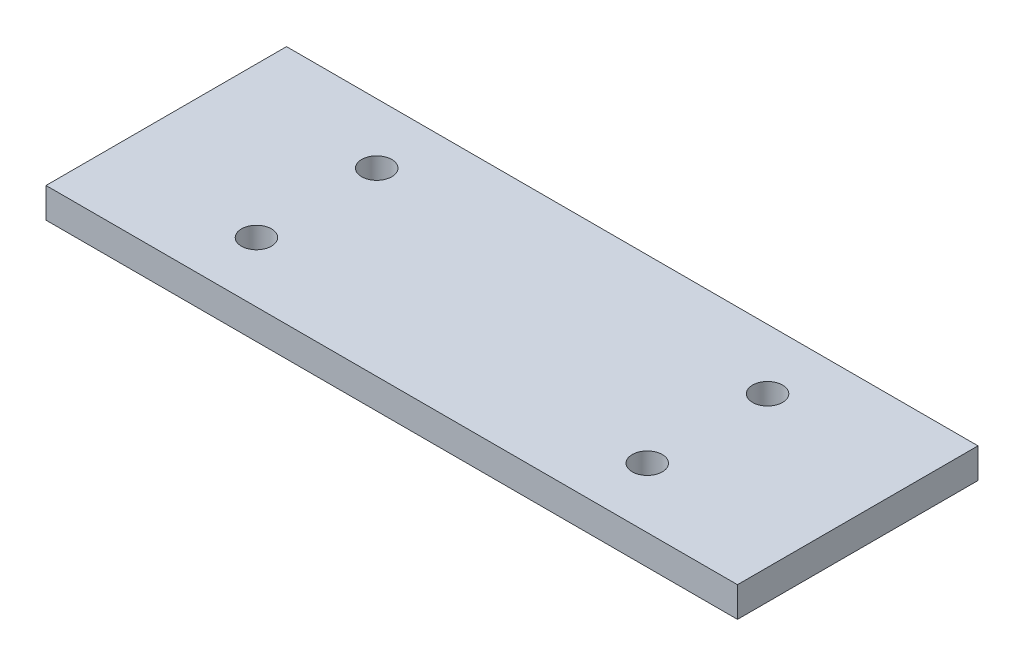
ISO-10303-21;
HEADER;
FILE_DESCRIPTION(('STEP AP214'),'2;1');
FILE_NAME('part.step','',(''),(''),'','','');
FILE_SCHEMA(('AUTOMOTIVE_DESIGN { 1 0 10303 214 1 1 1 1 }'));
ENDSEC;
DATA;
#1=APPLICATION_CONTEXT('core data for automotive mechanical design processes');
#2=APPLICATION_PROTOCOL_DEFINITION('international standard','automotive_design',2000,#1);
#3=PRODUCT_CONTEXT('',#1,'mechanical');
#4=PRODUCT('Part','Part','',(#3));
#5=PRODUCT_RELATED_PRODUCT_CATEGORY('part','',(#4));
#6=PRODUCT_DEFINITION_FORMATION('','',#4);
#7=PRODUCT_DEFINITION_CONTEXT('part definition',#1,'design');
#8=PRODUCT_DEFINITION('design','',#6,#7);
#9=PRODUCT_DEFINITION_SHAPE('','',#8);
#10=(LENGTH_UNIT() NAMED_UNIT(*) SI_UNIT(.MILLI.,.METRE.));
#11=(NAMED_UNIT(*) PLANE_ANGLE_UNIT() SI_UNIT($,.RADIAN.));
#12=(NAMED_UNIT(*) SI_UNIT($,.STERADIAN.) SOLID_ANGLE_UNIT());
#13=UNCERTAINTY_MEASURE_WITH_UNIT(LENGTH_MEASURE(1.E-05),#10,'distance_accuracy_value','');
#14=(GEOMETRIC_REPRESENTATION_CONTEXT(3) GLOBAL_UNCERTAINTY_ASSIGNED_CONTEXT((#13)) GLOBAL_UNIT_ASSIGNED_CONTEXT((#10,
#11,#12)) REPRESENTATION_CONTEXT('',''));
#15=CARTESIAN_POINT('',(0.,0.,0.));
#16=DIRECTION('',(0.,0.,1.));
#17=DIRECTION('',(1.,0.,0.));
#18=AXIS2_PLACEMENT_3D('',#15,#16,#17);
#19=CARTESIAN_POINT('',(0.,5.,0.));
#20=DIRECTION('',(0.,1.,0.));
#21=DIRECTION('',(0.,0.,1.));
#22=AXIS2_PLACEMENT_3D('',#19,#20,#21);
#23=PLANE('',#22);
#24=CARTESIAN_POINT('',(32.5,5.,10.));
#25=DIRECTION('',(0.,1.,0.));
#26=DIRECTION('',(0.,0.,1.));
#27=AXIS2_PLACEMENT_3D('',#24,#25,#26);
#28=CIRCLE('',#27,2.5);
#29=CARTESIAN_POINT('',(32.5,5.,12.5));
#30=VERTEX_POINT('',#29);
#31=EDGE_CURVE('E121',#30,#30,#28,.T.);
#32=ORIENTED_EDGE('',*,*,#31,.F.);
#33=EDGE_LOOP('',(#32));
#34=FACE_BOUND('',#33,.T.);
#35=CARTESIAN_POINT('',(-32.5,5.,-10.));
#36=DIRECTION('',(0.,1.,0.));
#37=DIRECTION('',(0.,0.,1.));
#38=AXIS2_PLACEMENT_3D('',#35,#36,#37);
#39=CIRCLE('',#38,2.5);
#40=CARTESIAN_POINT('',(-32.5,5.,-7.49999999999999));
#41=VERTEX_POINT('',#40);
#42=EDGE_CURVE('E100',#41,#41,#39,.T.);
#43=ORIENTED_EDGE('',*,*,#42,.F.);
#44=EDGE_LOOP('',(#43));
#45=FACE_BOUND('',#44,.T.);
#46=DIRECTION('',(0.,0.,-1.));
#47=VECTOR('',#46,1.);
#48=CARTESIAN_POINT('',(57.5,5.,-20.));
#49=LINE('',#48,#47);
#50=CARTESIAN_POINT('',(57.5,5.,20.));
#51=VERTEX_POINT('',#50);
#52=CARTESIAN_POINT('',(57.5,5.,-20.));
#53=VERTEX_POINT('',#52);
#54=EDGE_CURVE('E85',#51,#53,#49,.T.);
#55=ORIENTED_EDGE('',*,*,#54,.T.);
#56=DIRECTION('',(-1.,0.,0.));
#57=VECTOR('',#56,1.);
#58=CARTESIAN_POINT('',(-57.5,5.,-20.));
#59=LINE('',#58,#57);
#60=CARTESIAN_POINT('',(-57.5,5.,-20.));
#61=VERTEX_POINT('',#60);
#62=EDGE_CURVE('E80',#53,#61,#59,.T.);
#63=ORIENTED_EDGE('',*,*,#62,.T.);
#64=DIRECTION('',(0.,0.,1.));
#65=VECTOR('',#64,1.);
#66=CARTESIAN_POINT('',(-57.5,5.,-20.));
#67=LINE('',#66,#65);
#68=CARTESIAN_POINT('',(-57.5,5.,20.));
#69=VERTEX_POINT('',#68);
#70=EDGE_CURVE('E83',#61,#69,#67,.T.);
#71=ORIENTED_EDGE('',*,*,#70,.T.);
#72=DIRECTION('',(1.,0.,0.));
#73=VECTOR('',#72,1.);
#74=CARTESIAN_POINT('',(-57.5,5.,20.));
#75=LINE('',#74,#73);
#76=EDGE_CURVE('E50',#69,#51,#75,.T.);
#77=ORIENTED_EDGE('',*,*,#76,.T.);
#78=EDGE_LOOP('',(#55,#63,#71,#77));
#79=FACE_BOUND('',#78,.T.);
#80=CARTESIAN_POINT('',(-32.5,5.,10.));
#81=DIRECTION('',(0.,1.,0.));
#82=DIRECTION('',(0.,0.,-1.));
#83=AXIS2_PLACEMENT_3D('',#80,#81,#82);
#84=CIRCLE('',#83,2.5);
#85=CARTESIAN_POINT('',(-32.5,5.,7.49999999999999));
#86=VERTEX_POINT('',#85);
#87=EDGE_CURVE('E115',#86,#86,#84,.T.);
#88=ORIENTED_EDGE('',*,*,#87,.F.);
#89=EDGE_LOOP('',(#88));
#90=FACE_BOUND('',#89,.T.);
#91=CARTESIAN_POINT('',(32.5,5.,-10.));
#92=DIRECTION('',(0.,1.,0.));
#93=DIRECTION('',(0.,0.,-1.));
#94=AXIS2_PLACEMENT_3D('',#91,#92,#93);
#95=CIRCLE('',#94,2.5);
#96=CARTESIAN_POINT('',(32.5,5.,-12.5));
#97=VERTEX_POINT('',#96);
#98=EDGE_CURVE('E127',#97,#97,#95,.T.);
#99=ORIENTED_EDGE('',*,*,#98,.F.);
#100=EDGE_LOOP('',(#99));
#101=FACE_BOUND('',#100,.T.);
#102=ADVANCED_FACE('F33',(#34,#45,#79,#90,#101),#23,.T.);
#103=CARTESIAN_POINT('',(0.,0.,0.));
#104=DIRECTION('',(0.,1.,0.));
#105=DIRECTION('',(0.,0.,1.));
#106=AXIS2_PLACEMENT_3D('',#103,#104,#105);
#107=PLANE('',#106);
#108=DIRECTION('',(0.,0.,-1.));
#109=VECTOR('',#108,1.);
#110=CARTESIAN_POINT('',(57.5,0.,-20.));
#111=LINE('',#110,#109);
#112=CARTESIAN_POINT('',(57.5,0.,20.));
#113=VERTEX_POINT('',#112);
#114=CARTESIAN_POINT('',(57.5,0.,-20.));
#115=VERTEX_POINT('',#114);
#116=EDGE_CURVE('E97',#113,#115,#111,.T.);
#117=ORIENTED_EDGE('',*,*,#116,.F.);
#118=DIRECTION('',(1.,0.,0.));
#119=VECTOR('',#118,1.);
#120=CARTESIAN_POINT('',(-57.5,0.,20.));
#121=LINE('',#120,#119);
#122=CARTESIAN_POINT('',(-57.5,0.,20.));
#123=VERTEX_POINT('',#122);
#124=EDGE_CURVE('E73',#123,#113,#121,.T.);
#125=ORIENTED_EDGE('',*,*,#124,.F.);
#126=DIRECTION('',(0.,0.,1.));
#127=VECTOR('',#126,1.);
#128=CARTESIAN_POINT('',(-57.5,0.,-20.));
#129=LINE('',#128,#127);
#130=CARTESIAN_POINT('',(-57.5,0.,-20.));
#131=VERTEX_POINT('',#130);
#132=EDGE_CURVE('E67',#131,#123,#129,.T.);
#133=ORIENTED_EDGE('',*,*,#132,.F.);
#134=DIRECTION('',(-1.,0.,0.));
#135=VECTOR('',#134,1.);
#136=CARTESIAN_POINT('',(-57.5,0.,-20.));
#137=LINE('',#136,#135);
#138=EDGE_CURVE('E89',#115,#131,#137,.T.);
#139=ORIENTED_EDGE('',*,*,#138,.F.);
#140=EDGE_LOOP('',(#117,#125,#133,#139));
#141=FACE_BOUND('',#140,.T.);
#142=CARTESIAN_POINT('',(-32.5,0.,-10.));
#143=DIRECTION('',(0.,1.,0.));
#144=DIRECTION('',(0.,0.,1.));
#145=AXIS2_PLACEMENT_3D('',#142,#143,#144);
#146=CIRCLE('',#145,2.5);
#147=CARTESIAN_POINT('',(-32.5,0.,-7.49999999999999));
#148=VERTEX_POINT('',#147);
#149=EDGE_CURVE('E112',#148,#148,#146,.T.);
#150=ORIENTED_EDGE('',*,*,#149,.T.);
#151=EDGE_LOOP('',(#150));
#152=FACE_BOUND('',#151,.T.);
#153=CARTESIAN_POINT('',(-32.5,0.,10.));
#154=DIRECTION('',(0.,1.,0.));
#155=DIRECTION('',(0.,0.,-1.));
#156=AXIS2_PLACEMENT_3D('',#153,#154,#155);
#157=CIRCLE('',#156,2.5);
#158=CARTESIAN_POINT('',(-32.5,0.,7.49999999999999));
#159=VERTEX_POINT('',#158);
#160=EDGE_CURVE('E118',#159,#159,#157,.T.);
#161=ORIENTED_EDGE('',*,*,#160,.T.);
#162=EDGE_LOOP('',(#161));
#163=FACE_BOUND('',#162,.T.);
#164=CARTESIAN_POINT('',(32.5,0.,10.));
#165=DIRECTION('',(0.,1.,0.));
#166=DIRECTION('',(0.,0.,1.));
#167=AXIS2_PLACEMENT_3D('',#164,#165,#166);
#168=CIRCLE('',#167,2.5);
#169=CARTESIAN_POINT('',(32.5,0.,12.5));
#170=VERTEX_POINT('',#169);
#171=EDGE_CURVE('E124',#170,#170,#168,.T.);
#172=ORIENTED_EDGE('',*,*,#171,.T.);
#173=EDGE_LOOP('',(#172));
#174=FACE_BOUND('',#173,.T.);
#175=CARTESIAN_POINT('',(32.5,0.,-10.));
#176=DIRECTION('',(0.,1.,0.));
#177=DIRECTION('',(0.,0.,-1.));
#178=AXIS2_PLACEMENT_3D('',#175,#176,#177);
#179=CIRCLE('',#178,2.5);
#180=CARTESIAN_POINT('',(32.5,0.,-12.5));
#181=VERTEX_POINT('',#180);
#182=EDGE_CURVE('E130',#181,#181,#179,.T.);
#183=ORIENTED_EDGE('',*,*,#182,.T.);
#184=EDGE_LOOP('',(#183));
#185=FACE_BOUND('',#184,.T.);
#186=ADVANCED_FACE('F108',(#141,#152,#163,#174,#185),#107,.F.);
#187=CARTESIAN_POINT('',(57.5,5.,-20.));
#188=DIRECTION('',(-1.,0.,0.));
#189=DIRECTION('',(0.,0.,1.));
#190=AXIS2_PLACEMENT_3D('',#187,#188,#189);
#191=PLANE('',#190);
#192=ORIENTED_EDGE('',*,*,#116,.T.);
#193=DIRECTION('',(0.,-1.,0.));
#194=VECTOR('',#193,1.);
#195=CARTESIAN_POINT('',(57.5,5.,-20.));
#196=LINE('',#195,#194);
#197=EDGE_CURVE('E11',#53,#115,#196,.T.);
#198=ORIENTED_EDGE('',*,*,#197,.F.);
#199=ORIENTED_EDGE('',*,*,#54,.F.);
#200=DIRECTION('',(0.,-1.,0.));
#201=VECTOR('',#200,1.);
#202=CARTESIAN_POINT('',(57.5,5.,20.));
#203=LINE('',#202,#201);
#204=EDGE_CURVE('E93',#51,#113,#203,.T.);
#205=ORIENTED_EDGE('',*,*,#204,.T.);
#206=EDGE_LOOP('',(#192,#198,#199,#205));
#207=FACE_BOUND('',#206,.T.);
#208=ADVANCED_FACE('F35',(#207),#191,.F.);
#209=CARTESIAN_POINT('',(-57.5,5.,-20.));
#210=DIRECTION('',(0.,0.,1.));
#211=DIRECTION('',(1.,0.,0.));
#212=AXIS2_PLACEMENT_3D('',#209,#210,#211);
#213=PLANE('',#212);
#214=ORIENTED_EDGE('',*,*,#138,.T.);
#215=DIRECTION('',(0.,-1.,0.));
#216=VECTOR('',#215,1.);
#217=CARTESIAN_POINT('',(-57.5,5.,-20.));
#218=LINE('',#217,#216);
#219=EDGE_CURVE('E42',#61,#131,#218,.T.);
#220=ORIENTED_EDGE('',*,*,#219,.F.);
#221=ORIENTED_EDGE('',*,*,#62,.F.);
#222=ORIENTED_EDGE('',*,*,#197,.T.);
#223=EDGE_LOOP('',(#214,#220,#221,#222));
#224=FACE_BOUND('',#223,.T.);
#225=ADVANCED_FACE('F88',(#224),#213,.F.);
#226=CARTESIAN_POINT('',(-57.5,5.,-20.));
#227=DIRECTION('',(1.,0.,0.));
#228=DIRECTION('',(0.,0.,-1.));
#229=AXIS2_PLACEMENT_3D('',#226,#227,#228);
#230=PLANE('',#229);
#231=ORIENTED_EDGE('',*,*,#132,.T.);
#232=DIRECTION('',(0.,-1.,0.));
#233=VECTOR('',#232,1.);
#234=CARTESIAN_POINT('',(-57.5,5.,20.));
#235=LINE('',#234,#233);
#236=EDGE_CURVE('E90',#69,#123,#235,.T.);
#237=ORIENTED_EDGE('',*,*,#236,.F.);
#238=ORIENTED_EDGE('',*,*,#70,.F.);
#239=ORIENTED_EDGE('',*,*,#219,.T.);
#240=EDGE_LOOP('',(#231,#237,#238,#239));
#241=FACE_BOUND('',#240,.T.);
#242=ADVANCED_FACE('F91',(#241),#230,.F.);
#243=CARTESIAN_POINT('',(-57.5,5.,20.));
#244=DIRECTION('',(0.,0.,-1.));
#245=DIRECTION('',(-1.,0.,0.));
#246=AXIS2_PLACEMENT_3D('',#243,#244,#245);
#247=PLANE('',#246);
#248=ORIENTED_EDGE('',*,*,#124,.T.);
#249=ORIENTED_EDGE('',*,*,#204,.F.);
#250=ORIENTED_EDGE('',*,*,#76,.F.);
#251=ORIENTED_EDGE('',*,*,#236,.T.);
#252=EDGE_LOOP('',(#248,#249,#250,#251));
#253=FACE_BOUND('',#252,.T.);
#254=ADVANCED_FACE('F105',(#253),#247,.F.);
#255=CARTESIAN_POINT('',(-32.5,5.,-10.));
#256=DIRECTION('',(0.,-1.,0.));
#257=DIRECTION('',(0.,0.,-1.));
#258=AXIS2_PLACEMENT_3D('',#255,#256,#257);
#259=CYLINDRICAL_SURFACE('',#258,2.5);
#260=ORIENTED_EDGE('',*,*,#42,.T.);
#261=EDGE_LOOP('',(#260));
#262=FACE_BOUND('',#261,.T.);
#263=ORIENTED_EDGE('',*,*,#149,.F.);
#264=EDGE_LOOP('',(#263));
#265=FACE_BOUND('',#264,.T.);
#266=ADVANCED_FACE('F149',(#262,#265),#259,.F.);
#267=CARTESIAN_POINT('',(-32.5,5.,10.));
#268=DIRECTION('',(0.,-1.,0.));
#269=DIRECTION('',(0.,0.,-1.));
#270=AXIS2_PLACEMENT_3D('',#267,#268,#269);
#271=CYLINDRICAL_SURFACE('',#270,2.5);
#272=ORIENTED_EDGE('',*,*,#87,.T.);
#273=EDGE_LOOP('',(#272));
#274=FACE_BOUND('',#273,.T.);
#275=ORIENTED_EDGE('',*,*,#160,.F.);
#276=EDGE_LOOP('',(#275));
#277=FACE_BOUND('',#276,.T.);
#278=ADVANCED_FACE('F195',(#274,#277),#271,.F.);
#279=CARTESIAN_POINT('',(32.5,5.,10.));
#280=DIRECTION('',(0.,-1.,0.));
#281=DIRECTION('',(0.,0.,-1.));
#282=AXIS2_PLACEMENT_3D('',#279,#280,#281);
#283=CYLINDRICAL_SURFACE('',#282,2.5);
#284=ORIENTED_EDGE('',*,*,#31,.T.);
#285=EDGE_LOOP('',(#284));
#286=FACE_BOUND('',#285,.T.);
#287=ORIENTED_EDGE('',*,*,#171,.F.);
#288=EDGE_LOOP('',(#287));
#289=FACE_BOUND('',#288,.T.);
#290=ADVANCED_FACE('F203',(#286,#289),#283,.F.);
#291=CARTESIAN_POINT('',(32.5,5.,-10.));
#292=DIRECTION('',(0.,-1.,0.));
#293=DIRECTION('',(0.,0.,-1.));
#294=AXIS2_PLACEMENT_3D('',#291,#292,#293);
#295=CYLINDRICAL_SURFACE('',#294,2.5);
#296=ORIENTED_EDGE('',*,*,#98,.T.);
#297=EDGE_LOOP('',(#296));
#298=FACE_BOUND('',#297,.T.);
#299=ORIENTED_EDGE('',*,*,#182,.F.);
#300=EDGE_LOOP('',(#299));
#301=FACE_BOUND('',#300,.T.);
#302=ADVANCED_FACE('F136',(#298,#301),#295,.F.);
#303=CLOSED_SHELL('',(#102,#186,#208,#225,#242,#254,#266,#278,#290,#302));
#304=MANIFOLD_SOLID_BREP('B2',#303);
#305=ADVANCED_BREP_SHAPE_REPRESENTATION('',(#18,#304),#14);
#306=SHAPE_DEFINITION_REPRESENTATION(#9,#305);
ENDSEC;
END-ISO-10303-21;
